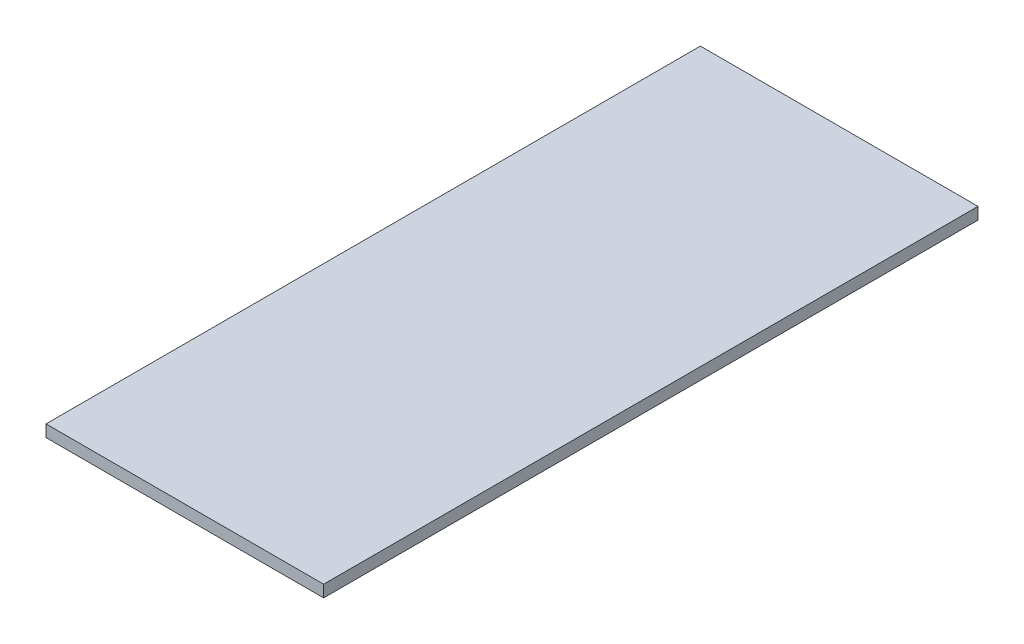
ISO-10303-21;
HEADER;
FILE_DESCRIPTION(('STEP AP214'),'2;1');
FILE_NAME('part.step','',(''),(''),'','','');
FILE_SCHEMA(('AUTOMOTIVE_DESIGN { 1 0 10303 214 1 1 1 1 }'));
ENDSEC;
DATA;
#1=APPLICATION_CONTEXT('core data for automotive mechanical design processes');
#2=APPLICATION_PROTOCOL_DEFINITION('international standard','automotive_design',2000,#1);
#3=PRODUCT_CONTEXT('',#1,'mechanical');
#4=PRODUCT('Part','Part','',(#3));
#5=PRODUCT_RELATED_PRODUCT_CATEGORY('part','',(#4));
#6=PRODUCT_DEFINITION_FORMATION('','',#4);
#7=PRODUCT_DEFINITION_CONTEXT('part definition',#1,'design');
#8=PRODUCT_DEFINITION('design','',#6,#7);
#9=PRODUCT_DEFINITION_SHAPE('','',#8);
#10=(LENGTH_UNIT() NAMED_UNIT(*) SI_UNIT(.MILLI.,.METRE.));
#11=(NAMED_UNIT(*) PLANE_ANGLE_UNIT() SI_UNIT($,.RADIAN.));
#12=(NAMED_UNIT(*) SI_UNIT($,.STERADIAN.) SOLID_ANGLE_UNIT());
#13=UNCERTAINTY_MEASURE_WITH_UNIT(LENGTH_MEASURE(1.E-05),#10,'distance_accuracy_value','');
#14=(GEOMETRIC_REPRESENTATION_CONTEXT(3) GLOBAL_UNCERTAINTY_ASSIGNED_CONTEXT((#13)) GLOBAL_UNIT_ASSIGNED_CONTEXT((#10,
#11,#12)) REPRESENTATION_CONTEXT('',''));
#15=CARTESIAN_POINT('',(0.,0.,0.));
#16=DIRECTION('',(0.,0.,1.));
#17=DIRECTION('',(1.,0.,0.));
#18=AXIS2_PLACEMENT_3D('',#15,#16,#17);
#19=CARTESIAN_POINT('',(3.5,0.15,8.25));
#20=DIRECTION('',(-1.,0.,0.));
#21=DIRECTION('',(0.,0.,1.));
#22=AXIS2_PLACEMENT_3D('',#19,#20,#21);
#23=PLANE('',#22);
#24=DIRECTION('',(0.,0.,-1.));
#25=VECTOR('',#24,1.);
#26=CARTESIAN_POINT('',(3.5,-0.15,8.25));
#27=LINE('',#26,#25);
#28=CARTESIAN_POINT('',(3.5,-0.15,8.25));
#29=VERTEX_POINT('',#28);
#30=CARTESIAN_POINT('',(3.5,-0.15,-8.25));
#31=VERTEX_POINT('',#30);
#32=EDGE_CURVE('E95',#29,#31,#27,.T.);
#33=ORIENTED_EDGE('',*,*,#32,.T.);
#34=DIRECTION('',(0.,-1.,0.));
#35=VECTOR('',#34,1.);
#36=CARTESIAN_POINT('',(3.5,0.15,-8.25));
#37=LINE('',#36,#35);
#38=CARTESIAN_POINT('',(3.5,0.15,-8.25));
#39=VERTEX_POINT('',#38);
#40=EDGE_CURVE('E11',#39,#31,#37,.T.);
#41=ORIENTED_EDGE('',*,*,#40,.F.);
#42=DIRECTION('',(0.,0.,-1.));
#43=VECTOR('',#42,1.);
#44=CARTESIAN_POINT('',(3.5,0.15,8.25));
#45=LINE('',#44,#43);
#46=CARTESIAN_POINT('',(3.5,0.15,8.25));
#47=VERTEX_POINT('',#46);
#48=EDGE_CURVE('E83',#47,#39,#45,.T.);
#49=ORIENTED_EDGE('',*,*,#48,.F.);
#50=DIRECTION('',(0.,-1.,0.));
#51=VECTOR('',#50,1.);
#52=CARTESIAN_POINT('',(3.5,0.15,8.25));
#53=LINE('',#52,#51);
#54=EDGE_CURVE('E91',#47,#29,#53,.T.);
#55=ORIENTED_EDGE('',*,*,#54,.T.);
#56=EDGE_LOOP('',(#33,#41,#49,#55));
#57=FACE_BOUND('',#56,.T.);
#58=ADVANCED_FACE('F32',(#57),#23,.F.);
#59=CARTESIAN_POINT('',(-3.5,0.15,-8.25));
#60=DIRECTION('',(0.,0.,1.));
#61=DIRECTION('',(1.,0.,0.));
#62=AXIS2_PLACEMENT_3D('',#59,#60,#61);
#63=PLANE('',#62);
#64=DIRECTION('',(-1.,0.,0.));
#65=VECTOR('',#64,1.);
#66=CARTESIAN_POINT('',(-3.5,-0.15,-8.25));
#67=LINE('',#66,#65);
#68=CARTESIAN_POINT('',(-3.5,-0.15,-8.25));
#69=VERTEX_POINT('',#68);
#70=EDGE_CURVE('E87',#31,#69,#67,.T.);
#71=ORIENTED_EDGE('',*,*,#70,.T.);
#72=DIRECTION('',(0.,-1.,0.));
#73=VECTOR('',#72,1.);
#74=CARTESIAN_POINT('',(-3.5,0.15,-8.25));
#75=LINE('',#74,#73);
#76=CARTESIAN_POINT('',(-3.5,0.15,-8.25));
#77=VERTEX_POINT('',#76);
#78=EDGE_CURVE('E40',#77,#69,#75,.T.);
#79=ORIENTED_EDGE('',*,*,#78,.F.);
#80=DIRECTION('',(-1.,0.,0.));
#81=VECTOR('',#80,1.);
#82=CARTESIAN_POINT('',(-3.5,0.15,-8.25));
#83=LINE('',#82,#81);
#84=EDGE_CURVE('E78',#39,#77,#83,.T.);
#85=ORIENTED_EDGE('',*,*,#84,.F.);
#86=ORIENTED_EDGE('',*,*,#40,.T.);
#87=EDGE_LOOP('',(#71,#79,#85,#86));
#88=FACE_BOUND('',#87,.T.);
#89=ADVANCED_FACE('F86',(#88),#63,.F.);
#90=CARTESIAN_POINT('',(-3.5,0.15,8.25));
#91=DIRECTION('',(1.,0.,0.));
#92=DIRECTION('',(0.,0.,-1.));
#93=AXIS2_PLACEMENT_3D('',#90,#91,#92);
#94=PLANE('',#93);
#95=DIRECTION('',(0.,0.,1.));
#96=VECTOR('',#95,1.);
#97=CARTESIAN_POINT('',(-3.5,-0.15,8.25));
#98=LINE('',#97,#96);
#99=CARTESIAN_POINT('',(-3.5,-0.15,8.25));
#100=VERTEX_POINT('',#99);
#101=EDGE_CURVE('E65',#69,#100,#98,.T.);
#102=ORIENTED_EDGE('',*,*,#101,.T.);
#103=DIRECTION('',(0.,-1.,0.));
#104=VECTOR('',#103,1.);
#105=CARTESIAN_POINT('',(-3.5,0.15,8.25));
#106=LINE('',#105,#104);
#107=CARTESIAN_POINT('',(-3.5,0.15,8.25));
#108=VERTEX_POINT('',#107);
#109=EDGE_CURVE('E88',#108,#100,#106,.T.);
#110=ORIENTED_EDGE('',*,*,#109,.F.);
#111=DIRECTION('',(0.,0.,1.));
#112=VECTOR('',#111,1.);
#113=CARTESIAN_POINT('',(-3.5,0.15,8.25));
#114=LINE('',#113,#112);
#115=EDGE_CURVE('E81',#77,#108,#114,.T.);
#116=ORIENTED_EDGE('',*,*,#115,.F.);
#117=ORIENTED_EDGE('',*,*,#78,.T.);
#118=EDGE_LOOP('',(#102,#110,#116,#117));
#119=FACE_BOUND('',#118,.T.);
#120=ADVANCED_FACE('F89',(#119),#94,.F.);
#121=CARTESIAN_POINT('',(-3.5,0.15,8.25));
#122=DIRECTION('',(0.,0.,-1.));
#123=DIRECTION('',(-1.,0.,0.));
#124=AXIS2_PLACEMENT_3D('',#121,#122,#123);
#125=PLANE('',#124);
#126=DIRECTION('',(1.,0.,0.));
#127=VECTOR('',#126,1.);
#128=CARTESIAN_POINT('',(-3.5,-0.15,8.25));
#129=LINE('',#128,#127);
#130=EDGE_CURVE('E71',#100,#29,#129,.T.);
#131=ORIENTED_EDGE('',*,*,#130,.T.);
#132=ORIENTED_EDGE('',*,*,#54,.F.);
#133=DIRECTION('',(1.,0.,0.));
#134=VECTOR('',#133,1.);
#135=CARTESIAN_POINT('',(-3.5,0.15,8.25));
#136=LINE('',#135,#134);
#137=EDGE_CURVE('E48',#108,#47,#136,.T.);
#138=ORIENTED_EDGE('',*,*,#137,.F.);
#139=ORIENTED_EDGE('',*,*,#109,.T.);
#140=EDGE_LOOP('',(#131,#132,#138,#139));
#141=FACE_BOUND('',#140,.T.);
#142=ADVANCED_FACE('F102',(#141),#125,.F.);
#143=CARTESIAN_POINT('',(0.,0.15,0.));
#144=DIRECTION('',(0.,-1.,0.));
#145=DIRECTION('',(0.,0.,-1.));
#146=AXIS2_PLACEMENT_3D('',#143,#144,#145);
#147=PLANE('',#146);
#148=ORIENTED_EDGE('',*,*,#48,.T.);
#149=ORIENTED_EDGE('',*,*,#84,.T.);
#150=ORIENTED_EDGE('',*,*,#115,.T.);
#151=ORIENTED_EDGE('',*,*,#137,.T.);
#152=EDGE_LOOP('',(#148,#149,#150,#151));
#153=FACE_BOUND('',#152,.T.);
#154=ADVANCED_FACE('F79',(#153),#147,.F.);
#155=CARTESIAN_POINT('',(0.,-0.15,0.));
#156=DIRECTION('',(0.,-1.,0.));
#157=DIRECTION('',(0.,0.,-1.));
#158=AXIS2_PLACEMENT_3D('',#155,#156,#157);
#159=PLANE('',#158);
#160=ORIENTED_EDGE('',*,*,#32,.F.);
#161=ORIENTED_EDGE('',*,*,#130,.F.);
#162=ORIENTED_EDGE('',*,*,#101,.F.);
#163=ORIENTED_EDGE('',*,*,#70,.F.);
#164=EDGE_LOOP('',(#160,#161,#162,#163));
#165=FACE_BOUND('',#164,.T.);
#166=ADVANCED_FACE('F105',(#165),#159,.T.);
#167=CLOSED_SHELL('',(#58,#89,#120,#142,#154,#166));
#168=MANIFOLD_SOLID_BREP('B2',#167);
#169=ADVANCED_BREP_SHAPE_REPRESENTATION('',(#18,#168),#14);
#170=SHAPE_DEFINITION_REPRESENTATION(#9,#169);
ENDSEC;
END-ISO-10303-21;
